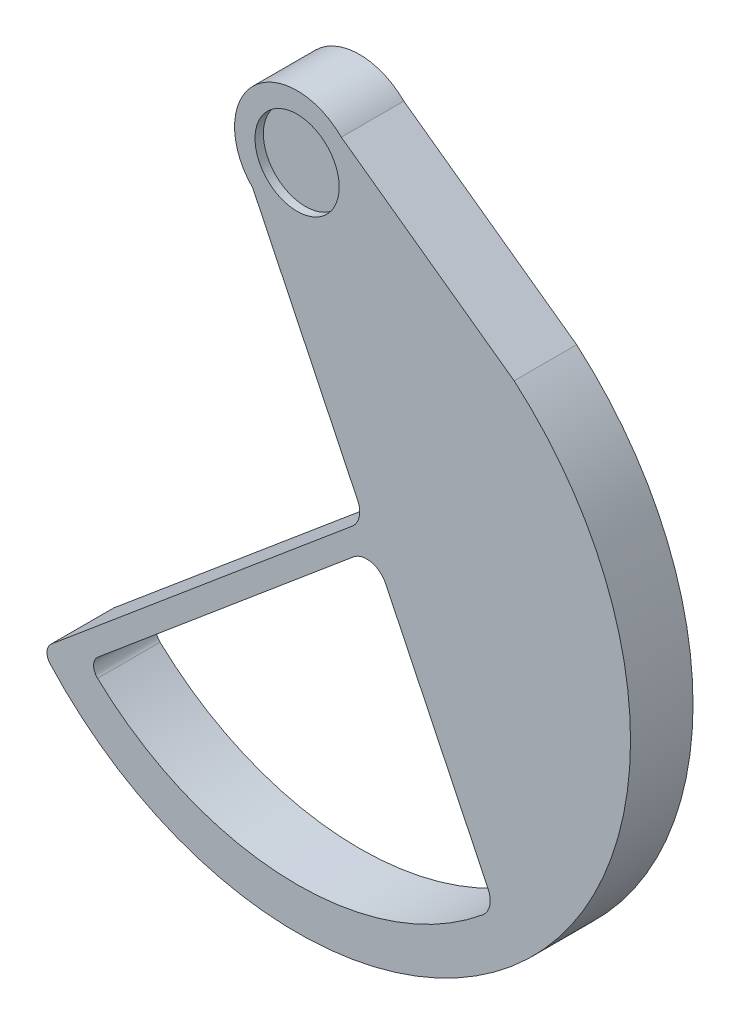
ISO-10303-21;
HEADER;
FILE_DESCRIPTION(('STEP AP214'),'2;1');
FILE_NAME('part.step','',(''),(''),'','','');
FILE_SCHEMA(('AUTOMOTIVE_DESIGN { 1 0 10303 214 1 1 1 1 }'));
ENDSEC;
DATA;
#1=APPLICATION_CONTEXT('core data for automotive mechanical design processes');
#2=APPLICATION_PROTOCOL_DEFINITION('international standard','automotive_design',2000,#1);
#3=PRODUCT_CONTEXT('',#1,'mechanical');
#4=PRODUCT('Part','Part','',(#3));
#5=PRODUCT_RELATED_PRODUCT_CATEGORY('part','',(#4));
#6=PRODUCT_DEFINITION_FORMATION('','',#4);
#7=PRODUCT_DEFINITION_CONTEXT('part definition',#1,'design');
#8=PRODUCT_DEFINITION('design','',#6,#7);
#9=PRODUCT_DEFINITION_SHAPE('','',#8);
#10=(LENGTH_UNIT() NAMED_UNIT(*) SI_UNIT(.MILLI.,.METRE.));
#11=(NAMED_UNIT(*) PLANE_ANGLE_UNIT() SI_UNIT($,.RADIAN.));
#12=(NAMED_UNIT(*) SI_UNIT($,.STERADIAN.) SOLID_ANGLE_UNIT());
#13=UNCERTAINTY_MEASURE_WITH_UNIT(LENGTH_MEASURE(1.E-05),#10,'distance_accuracy_value','');
#14=(GEOMETRIC_REPRESENTATION_CONTEXT(3) GLOBAL_UNCERTAINTY_ASSIGNED_CONTEXT((#13)) GLOBAL_UNIT_ASSIGNED_CONTEXT((#10,
#11,#12)) REPRESENTATION_CONTEXT('',''));
#15=CARTESIAN_POINT('',(0.,0.,0.));
#16=DIRECTION('',(0.,0.,1.));
#17=DIRECTION('',(1.,0.,0.));
#18=AXIS2_PLACEMENT_3D('',#15,#16,#17);
#19=CARTESIAN_POINT('',(-12.7570586950624,-6.1348621133076,15.));
#20=DIRECTION('',(0.901206602628173,0.433389731511241,0.));
#21=DIRECTION('',(-0.433389731511241,0.901206602628173,0.));
#22=AXIS2_PLACEMENT_3D('',#19,#20,#21);
#23=PLANE('',#22);
#24=DIRECTION('',(0.433389731511241,-0.901206602628173,0.));
#25=VECTOR('',#24,1.);
#26=CARTESIAN_POINT('',(-12.7570586950624,-6.1348621133076,0.));
#27=LINE('',#26,#25);
#28=CARTESIAN_POINT('',(21.2324006956412,-76.8137984043253,0.));
#29=VERTEX_POINT('',#28);
#30=CARTESIAN_POINT('',(45.844843506453,-127.9938203457,0.));
#31=VERTEX_POINT('',#30);
#32=EDGE_CURVE('E185',#29,#31,#27,.T.);
#33=ORIENTED_EDGE('',*,*,#32,.T.);
#34=DIRECTION('',(0.,0.,-1.));
#35=VECTOR('',#34,1.);
#36=CARTESIAN_POINT('',(45.844843506453,-127.9938203457,15.));
#37=LINE('',#36,#35);
#38=CARTESIAN_POINT('',(45.844843506453,-127.9938203457,15.));
#39=VERTEX_POINT('',#38);
#40=EDGE_CURVE('E11',#39,#31,#37,.T.);
#41=ORIENTED_EDGE('',*,*,#40,.F.);
#42=DIRECTION('',(0.433389731511241,-0.901206602628173,0.));
#43=VECTOR('',#42,1.);
#44=CARTESIAN_POINT('',(-12.7570586950624,-6.1348621133076,15.));
#45=LINE('',#44,#43);
#46=CARTESIAN_POINT('',(21.2324006956412,-76.8137984043253,15.));
#47=VERTEX_POINT('',#46);
#48=EDGE_CURVE('E250',#47,#39,#45,.T.);
#49=ORIENTED_EDGE('',*,*,#48,.F.);
#50=DIRECTION('',(0.,0.,-1.));
#51=VECTOR('',#50,1.);
#52=CARTESIAN_POINT('',(21.2324006956412,-76.8137984043253,15.));
#53=LINE('',#52,#51);
#54=EDGE_CURVE('E198',#47,#29,#53,.T.);
#55=ORIENTED_EDGE('',*,*,#54,.T.);
#56=EDGE_LOOP('',(#33,#41,#49,#55));
#57=FACE_BOUND('',#56,.T.);
#58=ADVANCED_FACE('F35',(#57),#23,.F.);
#59=CARTESIAN_POINT('',(41.3388104933121,-130.160769003256,15.));
#60=DIRECTION('',(0.,0.,-1.));
#61=DIRECTION('',(-1.,0.,0.));
#62=AXIS2_PLACEMENT_3D('',#59,#60,#61);
#63=CYLINDRICAL_SURFACE('',#62,4.99999999999999);
#64=CARTESIAN_POINT('',(41.3388104933121,-130.160769003256,0.));
#65=DIRECTION('',(0.,0.,1.));
#66=DIRECTION('',(1.,0.,0.));
#67=AXIS2_PLACEMENT_3D('',#64,#65,#66);
#68=CIRCLE('',#67,4.99999999999999);
#69=CARTESIAN_POINT('',(44.5187189927976,-134.019289695814,0.));
#70=VERTEX_POINT('',#69);
#71=EDGE_CURVE('E188',#31,#70,#68,.F.);
#72=ORIENTED_EDGE('',*,*,#71,.T.);
#73=DIRECTION('',(0.,0.,-1.));
#74=VECTOR('',#73,1.);
#75=CARTESIAN_POINT('',(44.5187189927976,-134.019289695814,15.));
#76=LINE('',#75,#74);
#77=CARTESIAN_POINT('',(44.5187189927976,-134.019289695814,15.));
#78=VERTEX_POINT('',#77);
#79=EDGE_CURVE('E45',#78,#70,#76,.T.);
#80=ORIENTED_EDGE('',*,*,#79,.F.);
#81=CARTESIAN_POINT('',(41.3388104933121,-130.160769003256,15.));
#82=DIRECTION('',(0.,0.,1.));
#83=DIRECTION('',(1.,0.,0.));
#84=AXIS2_PLACEMENT_3D('',#81,#82,#83);
#85=CIRCLE('',#84,4.99999999999999);
#86=EDGE_CURVE('E252',#39,#78,#85,.F.);
#87=ORIENTED_EDGE('',*,*,#86,.F.);
#88=ORIENTED_EDGE('',*,*,#40,.T.);
#89=EDGE_LOOP('',(#72,#80,#87,#88));
#90=FACE_BOUND('',#89,.T.);
#91=ADVANCED_FACE('F277',(#90),#63,.F.);
#92=CARTESIAN_POINT('',(0.,-80.,15.));
#93=DIRECTION('',(0.,0.,-1.));
#94=DIRECTION('',(-1.,0.,0.));
#95=AXIS2_PLACEMENT_3D('',#92,#93,#94);
#96=CYLINDRICAL_SURFACE('',#95,70.);
#97=CARTESIAN_POINT('',(0.,-80.,0.));
#98=DIRECTION('',(0.,0.,1.));
#99=DIRECTION('',(1.,0.,0.));
#100=AXIS2_PLACEMENT_3D('',#97,#98,#99);
#101=CIRCLE('',#100,70.);
#102=CARTESIAN_POINT('',(-47.870174388264,-131.072951785042,0.));
#103=VERTEX_POINT('',#102);
#104=EDGE_CURVE('E191',#103,#70,#101,.T.);
#105=ORIENTED_EDGE('',*,*,#104,.F.);
#106=DIRECTION('',(0.,0.,-1.));
#107=VECTOR('',#106,1.);
#108=CARTESIAN_POINT('',(-47.870174388264,-131.072951785042,15.));
#109=LINE('',#108,#107);
#110=CARTESIAN_POINT('',(-47.870174388264,-131.072951785042,15.));
#111=VERTEX_POINT('',#110);
#112=EDGE_CURVE('E155',#111,#103,#109,.T.);
#113=ORIENTED_EDGE('',*,*,#112,.F.);
#114=CARTESIAN_POINT('',(0.,-80.,15.));
#115=DIRECTION('',(0.,0.,1.));
#116=DIRECTION('',(1.,0.,0.));
#117=AXIS2_PLACEMENT_3D('',#114,#115,#116);
#118=CIRCLE('',#117,70.);
#119=EDGE_CURVE('E148',#111,#78,#118,.T.);
#120=ORIENTED_EDGE('',*,*,#119,.T.);
#121=ORIENTED_EDGE('',*,*,#79,.T.);
#122=EDGE_LOOP('',(#105,#113,#120,#121));
#123=FACE_BOUND('',#122,.T.);
#124=ADVANCED_FACE('F255',(#123),#96,.F.);
#125=CARTESIAN_POINT('',(-45.8185954859101,-128.884110994254,15.));
#126=DIRECTION('',(0.,0.,-1.));
#127=DIRECTION('',(-1.,0.,0.));
#128=AXIS2_PLACEMENT_3D('',#125,#126,#127);
#129=CYLINDRICAL_SURFACE('',#128,2.99999999999979);
#130=CARTESIAN_POINT('',(-45.8185954859101,-128.884110994254,0.));
#131=DIRECTION('',(0.,0.,1.));
#132=DIRECTION('',(1.,0.,0.));
#133=AXIS2_PLACEMENT_3D('',#130,#131,#132);
#134=CIRCLE('',#133,2.99999999999979);
#135=CARTESIAN_POINT('',(-47.7476784165524,-126.586582094174,0.));
#136=VERTEX_POINT('',#135);
#137=EDGE_CURVE('E154',#103,#136,#134,.F.);
#138=ORIENTED_EDGE('',*,*,#137,.T.);
#139=DIRECTION('',(0.,0.,-1.));
#140=VECTOR('',#139,1.);
#141=CARTESIAN_POINT('',(-47.7476784165524,-126.586582094174,15.));
#142=LINE('',#141,#140);
#143=CARTESIAN_POINT('',(-47.7476784165524,-126.586582094174,15.));
#144=VERTEX_POINT('',#143);
#145=EDGE_CURVE('E151',#144,#136,#142,.T.);
#146=ORIENTED_EDGE('',*,*,#145,.F.);
#147=CARTESIAN_POINT('',(-45.8185954859101,-128.884110994254,15.));
#148=DIRECTION('',(0.,0.,1.));
#149=DIRECTION('',(1.,0.,0.));
#150=AXIS2_PLACEMENT_3D('',#147,#148,#149);
#151=CIRCLE('',#150,2.99999999999979);
#152=EDGE_CURVE('E142',#111,#144,#151,.F.);
#153=ORIENTED_EDGE('',*,*,#152,.F.);
#154=ORIENTED_EDGE('',*,*,#112,.T.);
#155=EDGE_LOOP('',(#138,#146,#153,#154));
#156=FACE_BOUND('',#155,.T.);
#157=ADVANCED_FACE('F152',(#156),#129,.F.);
#158=CARTESIAN_POINT('',(42.5956727933285,-50.7312504333006,15.));
#159=DIRECTION('',(-0.643027643547508,0.765842966693394,0.));
#160=DIRECTION('',(-0.765842966693394,-0.643027643547508,0.));
#161=AXIS2_PLACEMENT_3D('',#158,#159,#160);
#162=PLANE('',#161);
#163=DIRECTION('',(0.765842966693394,0.643027643547508,0.));
#164=VECTOR('',#163,1.);
#165=CARTESIAN_POINT('',(42.5956727933285,-50.7312504333006,0.));
#166=LINE('',#165,#164);
#167=CARTESIAN_POINT('',(13.5112294647628,-75.1515322284145,0.));
#168=VERTEX_POINT('',#167);
#169=EDGE_CURVE('E98',#136,#168,#166,.T.);
#170=ORIENTED_EDGE('',*,*,#169,.T.);
#171=DIRECTION('',(0.,0.,-1.));
#172=VECTOR('',#171,1.);
#173=CARTESIAN_POINT('',(13.5112294647628,-75.1515322284145,15.));
#174=LINE('',#173,#172);
#175=CARTESIAN_POINT('',(13.5112294647628,-75.1515322284145,15.));
#176=VERTEX_POINT('',#175);
#177=EDGE_CURVE('E156',#176,#168,#174,.T.);
#178=ORIENTED_EDGE('',*,*,#177,.F.);
#179=DIRECTION('',(0.765842966693394,0.643027643547508,0.));
#180=VECTOR('',#179,1.);
#181=CARTESIAN_POINT('',(42.5956727933285,-50.7312504333006,15.));
#182=LINE('',#181,#180);
#183=EDGE_CURVE('E146',#144,#176,#182,.T.);
#184=ORIENTED_EDGE('',*,*,#183,.F.);
#185=ORIENTED_EDGE('',*,*,#145,.T.);
#186=EDGE_LOOP('',(#170,#178,#184,#185));
#187=FACE_BOUND('',#186,.T.);
#188=ADVANCED_FACE('F158',(#187),#162,.F.);
#189=CARTESIAN_POINT('',(10.0302471408598,-65.0565868768263,15.));
#190=DIRECTION('',(0.,0.,-1.));
#191=DIRECTION('',(-1.,0.,0.));
#192=AXIS2_PLACEMENT_3D('',#189,#190,#191);
#193=CYLINDRICAL_SURFACE('',#192,5.);
#194=CARTESIAN_POINT('',(10.0302471408598,-65.0565868768263,0.));
#195=DIRECTION('',(0.,0.,1.));
#196=DIRECTION('',(1.,0.,0.));
#197=AXIS2_PLACEMENT_3D('',#194,#195,#196);
#198=CIRCLE('',#197,5.);
#199=CARTESIAN_POINT('',(13.2441851892925,-68.8868090924212,0.));
#200=VERTEX_POINT('',#199);
#201=CARTESIAN_POINT('',(14.5362801540007,-62.8896382192701,0.));
#202=VERTEX_POINT('',#201);
#203=EDGE_CURVE('E164',#200,#202,#198,.T.);
#204=ORIENTED_EDGE('',*,*,#203,.F.);
#205=DIRECTION('',(0.,0.,-1.));
#206=VECTOR('',#205,1.);
#207=CARTESIAN_POINT('',(13.2441851892925,-68.8868090924212,15.));
#208=LINE('',#207,#206);
#209=CARTESIAN_POINT('',(13.2441851892925,-68.8868090924212,15.));
#210=VERTEX_POINT('',#209);
#211=EDGE_CURVE('E39',#210,#200,#208,.T.);
#212=ORIENTED_EDGE('',*,*,#211,.F.);
#213=CARTESIAN_POINT('',(10.0302471408598,-65.0565868768263,15.));
#214=DIRECTION('',(0.,0.,1.));
#215=DIRECTION('',(1.,0.,0.));
#216=AXIS2_PLACEMENT_3D('',#213,#214,#215);
#217=CIRCLE('',#216,5.);
#218=CARTESIAN_POINT('',(14.5362801540007,-62.8896382192701,15.));
#219=VERTEX_POINT('',#218);
#220=EDGE_CURVE('E197',#210,#219,#217,.T.);
#221=ORIENTED_EDGE('',*,*,#220,.T.);
#222=DIRECTION('',(0.,0.,-1.));
#223=VECTOR('',#222,1.);
#224=CARTESIAN_POINT('',(14.5362801540007,-62.8896382192701,15.));
#225=LINE('',#224,#223);
#226=EDGE_CURVE('E160',#219,#202,#225,.T.);
#227=ORIENTED_EDGE('',*,*,#226,.T.);
#228=EDGE_LOOP('',(#204,#212,#221,#227));
#229=FACE_BOUND('',#228,.T.);
#230=ADVANCED_FACE('F37',(#229),#193,.F.);
#231=CARTESIAN_POINT('',(39.3923101204882,-46.9459271066778,15.));
#232=DIRECTION('',(-0.642787609686534,0.766044443118983,0.));
#233=DIRECTION('',(-0.766044443118982,-0.642787609686534,0.));
#234=AXIS2_PLACEMENT_3D('',#231,#232,#233);
#235=PLANE('',#234);
#236=DIRECTION('',(0.766044443118982,0.642787609686534,0.));
#237=VECTOR('',#236,1.);
#238=CARTESIAN_POINT('',(39.3923101204882,-46.9459271066778,0.));
#239=LINE('',#238,#237);
#240=CARTESIAN_POINT('',(-58.9406362868111,-129.457066169617,0.));
#241=VERTEX_POINT('',#240);
#242=EDGE_CURVE('E167',#241,#200,#239,.T.);
#243=ORIENTED_EDGE('',*,*,#242,.F.);
#244=DIRECTION('',(0.,0.,-1.));
#245=VECTOR('',#244,1.);
#246=CARTESIAN_POINT('',(-58.9406362868111,-129.457066169617,15.));
#247=LINE('',#246,#245);
#248=CARTESIAN_POINT('',(-58.9406362868111,-129.457066169617,15.));
#249=VERTEX_POINT('',#248);
#250=EDGE_CURVE('E212',#249,#241,#247,.T.);
#251=ORIENTED_EDGE('',*,*,#250,.F.);
#252=DIRECTION('',(0.766044443118982,0.642787609686534,0.));
#253=VECTOR('',#252,1.);
#254=CARTESIAN_POINT('',(39.3923101204882,-46.9459271066778,15.));
#255=LINE('',#254,#253);
#256=EDGE_CURVE('E221',#249,#210,#255,.T.);
#257=ORIENTED_EDGE('',*,*,#256,.T.);
#258=ORIENTED_EDGE('',*,*,#211,.T.);
#259=EDGE_LOOP('',(#243,#251,#257,#258));
#260=FACE_BOUND('',#259,.T.);
#261=ADVANCED_FACE('F219',(#260),#235,.T.);
#262=CARTESIAN_POINT('',(-57.0122734577518,-131.755199498973,15.));
#263=DIRECTION('',(0.,0.,-1.));
#264=DIRECTION('',(-1.,0.,0.));
#265=AXIS2_PLACEMENT_3D('',#262,#263,#264);
#266=CYLINDRICAL_SURFACE('',#265,2.99999999999976);
#267=CARTESIAN_POINT('',(-57.0122734577518,-131.755199498973,0.));
#268=DIRECTION('',(0.,0.,1.));
#269=DIRECTION('',(1.,0.,0.));
#270=AXIS2_PLACEMENT_3D('',#267,#268,#269);
#271=CIRCLE('',#270,2.99999999999976);
#272=CARTESIAN_POINT('',(-59.2335308651964,-133.771635843089,0.));
#273=VERTEX_POINT('',#272);
#274=EDGE_CURVE('E171',#273,#241,#271,.F.);
#275=ORIENTED_EDGE('',*,*,#274,.F.);
#276=DIRECTION('',(0.,0.,-1.));
#277=VECTOR('',#276,1.);
#278=CARTESIAN_POINT('',(-59.2335308651964,-133.771635843089,15.));
#279=LINE('',#278,#277);
#280=CARTESIAN_POINT('',(-59.2335308651964,-133.771635843089,15.));
#281=VERTEX_POINT('',#280);
#282=EDGE_CURVE('E211',#281,#273,#279,.T.);
#283=ORIENTED_EDGE('',*,*,#282,.F.);
#284=CARTESIAN_POINT('',(-57.0122734577518,-131.755199498973,15.));
#285=DIRECTION('',(0.,0.,1.));
#286=DIRECTION('',(1.,0.,0.));
#287=AXIS2_PLACEMENT_3D('',#284,#285,#286);
#288=CIRCLE('',#287,2.99999999999976);
#289=EDGE_CURVE('E231',#281,#249,#288,.F.);
#290=ORIENTED_EDGE('',*,*,#289,.T.);
#291=ORIENTED_EDGE('',*,*,#250,.T.);
#292=EDGE_LOOP('',(#275,#283,#290,#291));
#293=FACE_BOUND('',#292,.T.);
#294=ADVANCED_FACE('F228',(#293),#266,.T.);
#295=CARTESIAN_POINT('',(0.,-80.,15.));
#296=DIRECTION('',(0.,0.,-1.));
#297=DIRECTION('',(-1.,0.,0.));
#298=AXIS2_PLACEMENT_3D('',#295,#296,#297);
#299=CYLINDRICAL_SURFACE('',#298,80.);
#300=CARTESIAN_POINT('',(0.,-80.,0.));
#301=DIRECTION('',(0.,0.,1.));
#302=DIRECTION('',(1.,0.,0.));
#303=AXIS2_PLACEMENT_3D('',#300,#301,#302);
#304=CIRCLE('',#303,80.);
#305=CARTESIAN_POINT('',(52.0761789176771,-19.2705047828151,0.));
#306=VERTEX_POINT('',#305);
#307=EDGE_CURVE('E174',#273,#306,#304,.T.);
#308=ORIENTED_EDGE('',*,*,#307,.T.);
#309=DIRECTION('',(0.,0.,-1.));
#310=VECTOR('',#309,1.);
#311=CARTESIAN_POINT('',(52.0761789176771,-19.2705047828151,15.));
#312=LINE('',#311,#310);
#313=CARTESIAN_POINT('',(52.0761789176771,-19.2705047828151,15.));
#314=VERTEX_POINT('',#313);
#315=EDGE_CURVE('E209',#314,#306,#312,.T.);
#316=ORIENTED_EDGE('',*,*,#315,.F.);
#317=CARTESIAN_POINT('',(0.,-80.,15.));
#318=DIRECTION('',(0.,0.,1.));
#319=DIRECTION('',(1.,0.,0.));
#320=AXIS2_PLACEMENT_3D('',#317,#318,#319);
#321=CIRCLE('',#320,80.);
#322=EDGE_CURVE('E234',#281,#314,#321,.T.);
#323=ORIENTED_EDGE('',*,*,#322,.F.);
#324=ORIENTED_EDGE('',*,*,#282,.T.);
#325=EDGE_LOOP('',(#308,#316,#323,#324));
#326=FACE_BOUND('',#325,.T.);
#327=ADVANCED_FACE('F235',(#326),#299,.T.);
#328=CARTESIAN_POINT('',(8.65474635415258,12.0128323695447,15.));
#329=DIRECTION('',(0.584549661802916,0.811357931424902,0.));
#330=DIRECTION('',(-0.811357931424902,0.584549661802916,0.));
#331=AXIS2_PLACEMENT_3D('',#328,#329,#330);
#332=PLANE('',#331);
#333=DIRECTION('',(0.811357931424902,-0.584549661802916,0.));
#334=VECTOR('',#333,1.);
#335=CARTESIAN_POINT('',(8.65474635415258,12.0128323695447,0.));
#336=LINE('',#335,#334);
#337=CARTESIAN_POINT('',(10.6066017177981,10.6066017177983,0.));
#338=VERTEX_POINT('',#337);
#339=EDGE_CURVE('E177',#338,#306,#336,.T.);
#340=ORIENTED_EDGE('',*,*,#339,.F.);
#341=DIRECTION('',(0.,0.,-1.));
#342=VECTOR('',#341,1.);
#343=CARTESIAN_POINT('',(10.6066017177981,10.6066017177983,15.));
#344=LINE('',#343,#342);
#345=CARTESIAN_POINT('',(10.6066017177981,10.6066017177983,15.));
#346=VERTEX_POINT('',#345);
#347=EDGE_CURVE('E207',#346,#338,#344,.T.);
#348=ORIENTED_EDGE('',*,*,#347,.F.);
#349=DIRECTION('',(0.811357931424902,-0.584549661802916,0.));
#350=VECTOR('',#349,1.);
#351=CARTESIAN_POINT('',(8.65474635415258,12.0128323695447,15.));
#352=LINE('',#351,#350);
#353=EDGE_CURVE('E239',#346,#314,#352,.T.);
#354=ORIENTED_EDGE('',*,*,#353,.T.);
#355=ORIENTED_EDGE('',*,*,#315,.T.);
#356=EDGE_LOOP('',(#340,#348,#354,#355));
#357=FACE_BOUND('',#356,.T.);
#358=ADVANCED_FACE('F288',(#357),#332,.T.);
#359=CARTESIAN_POINT('',(0.,0.,15.));
#360=DIRECTION('',(0.,0.,-1.));
#361=DIRECTION('',(-1.,0.,0.));
#362=AXIS2_PLACEMENT_3D('',#359,#360,#361);
#363=CYLINDRICAL_SURFACE('',#362,15.);
#364=CARTESIAN_POINT('',(0.,0.,0.));
#365=DIRECTION('',(0.,0.,1.));
#366=DIRECTION('',(1.,0.,0.));
#367=AXIS2_PLACEMENT_3D('',#364,#365,#366);
#368=CIRCLE('',#367,15.);
#369=CARTESIAN_POINT('',(-10.6066017177981,-10.6066017177983,0.));
#370=VERTEX_POINT('',#369);
#371=EDGE_CURVE('E180',#338,#370,#368,.T.);
#372=ORIENTED_EDGE('',*,*,#371,.T.);
#373=DIRECTION('',(0.,0.,-1.));
#374=VECTOR('',#373,1.);
#375=CARTESIAN_POINT('',(-10.6066017177981,-10.6066017177983,15.));
#376=LINE('',#375,#374);
#377=CARTESIAN_POINT('',(-10.6066017177981,-10.6066017177983,15.));
#378=VERTEX_POINT('',#377);
#379=EDGE_CURVE('E204',#378,#370,#376,.T.);
#380=ORIENTED_EDGE('',*,*,#379,.F.);
#381=CARTESIAN_POINT('',(0.,0.,15.));
#382=DIRECTION('',(0.,0.,1.));
#383=DIRECTION('',(1.,0.,0.));
#384=AXIS2_PLACEMENT_3D('',#381,#382,#383);
#385=CIRCLE('',#384,15.);
#386=EDGE_CURVE('E246',#346,#378,#385,.T.);
#387=ORIENTED_EDGE('',*,*,#386,.F.);
#388=ORIENTED_EDGE('',*,*,#347,.T.);
#389=EDGE_LOOP('',(#372,#380,#387,#388));
#390=FACE_BOUND('',#389,.T.);
#391=ADVANCED_FACE('F271',(#390),#363,.T.);
#392=CARTESIAN_POINT('',(-12.7570586950624,-6.13486211330761,15.));
#393=DIRECTION('',(0.901206602628173,0.433389731511242,0.));
#394=DIRECTION('',(-0.433389731511242,0.901206602628173,0.));
#395=AXIS2_PLACEMENT_3D('',#392,#393,#394);
#396=PLANE('',#395);
#397=DIRECTION('',(0.433389731511242,-0.901206602628173,0.));
#398=VECTOR('',#397,1.);
#399=CARTESIAN_POINT('',(-12.7570586950624,-6.13486211330761,0.));
#400=LINE('',#399,#398);
#401=EDGE_CURVE('E182',#370,#202,#400,.T.);
#402=ORIENTED_EDGE('',*,*,#401,.T.);
#403=ORIENTED_EDGE('',*,*,#226,.F.);
#404=DIRECTION('',(0.433389731511242,-0.901206602628173,0.));
#405=VECTOR('',#404,1.);
#406=CARTESIAN_POINT('',(-12.7570586950624,-6.13486211330761,15.));
#407=LINE('',#406,#405);
#408=EDGE_CURVE('E248',#378,#219,#407,.T.);
#409=ORIENTED_EDGE('',*,*,#408,.F.);
#410=ORIENTED_EDGE('',*,*,#379,.T.);
#411=EDGE_LOOP('',(#402,#403,#409,#410));
#412=FACE_BOUND('',#411,.T.);
#413=ADVANCED_FACE('F263',(#412),#396,.F.);
#414=CARTESIAN_POINT('',(16.7263676825004,-78.9807470618814,15.));
#415=DIRECTION('',(0.,0.,-1.));
#416=DIRECTION('',(-1.,0.,0.));
#417=AXIS2_PLACEMENT_3D('',#414,#415,#416);
#418=CYLINDRICAL_SURFACE('',#417,5.);
#419=CARTESIAN_POINT('',(16.7263676825004,-78.9807470618814,0.));
#420=DIRECTION('',(0.,0.,1.));
#421=DIRECTION('',(1.,0.,0.));
#422=AXIS2_PLACEMENT_3D('',#419,#420,#421);
#423=CIRCLE('',#422,5.);
#424=EDGE_CURVE('E104',#168,#29,#423,.F.);
#425=ORIENTED_EDGE('',*,*,#424,.T.);
#426=ORIENTED_EDGE('',*,*,#54,.F.);
#427=CARTESIAN_POINT('',(16.7263676825004,-78.9807470618814,15.));
#428=DIRECTION('',(0.,0.,1.));
#429=DIRECTION('',(1.,0.,0.));
#430=AXIS2_PLACEMENT_3D('',#427,#428,#429);
#431=CIRCLE('',#430,5.);
#432=EDGE_CURVE('E54',#176,#47,#431,.F.);
#433=ORIENTED_EDGE('',*,*,#432,.F.);
#434=ORIENTED_EDGE('',*,*,#177,.T.);
#435=EDGE_LOOP('',(#425,#426,#433,#434));
#436=FACE_BOUND('',#435,.T.);
#437=ADVANCED_FACE('F261',(#436),#418,.F.);
#438=CARTESIAN_POINT('',(0.,0.,15.));
#439=DIRECTION('',(0.,0.,1.));
#440=DIRECTION('',(1.,0.,0.));
#441=AXIS2_PLACEMENT_3D('',#438,#439,#440);
#442=PLANE('',#441);
#443=CARTESIAN_POINT('',(0.,0.,15.));
#444=DIRECTION('',(0.,0.,1.));
#445=DIRECTION('',(1.,0.,0.));
#446=AXIS2_PLACEMENT_3D('',#443,#444,#445);
#447=CIRCLE('',#446,10.1);
#448=CARTESIAN_POINT('',(10.1,0.,15.));
#449=VERTEX_POINT('',#448);
#450=EDGE_CURVE('E402',#449,#449,#447,.T.);
#451=ORIENTED_EDGE('',*,*,#450,.F.);
#452=EDGE_LOOP('',(#451));
#453=FACE_BOUND('',#452,.T.);
#454=ORIENTED_EDGE('',*,*,#220,.F.);
#455=ORIENTED_EDGE('',*,*,#256,.F.);
#456=ORIENTED_EDGE('',*,*,#289,.F.);
#457=ORIENTED_EDGE('',*,*,#322,.T.);
#458=ORIENTED_EDGE('',*,*,#353,.F.);
#459=ORIENTED_EDGE('',*,*,#386,.T.);
#460=ORIENTED_EDGE('',*,*,#408,.T.);
#461=EDGE_LOOP('',(#454,#455,#456,#457,#458,#459,#460));
#462=FACE_BOUND('',#461,.T.);
#463=ORIENTED_EDGE('',*,*,#48,.T.);
#464=ORIENTED_EDGE('',*,*,#86,.T.);
#465=ORIENTED_EDGE('',*,*,#119,.F.);
#466=ORIENTED_EDGE('',*,*,#152,.T.);
#467=ORIENTED_EDGE('',*,*,#183,.T.);
#468=ORIENTED_EDGE('',*,*,#432,.T.);
#469=EDGE_LOOP('',(#463,#464,#465,#466,#467,#468));
#470=FACE_BOUND('',#469,.T.);
#471=ADVANCED_FACE('F144',(#453,#462,#470),#442,.T.);
#472=CARTESIAN_POINT('',(0.,0.,0.));
#473=DIRECTION('',(0.,0.,1.));
#474=DIRECTION('',(1.,0.,0.));
#475=AXIS2_PLACEMENT_3D('',#472,#473,#474);
#476=PLANE('',#475);
#477=ORIENTED_EDGE('',*,*,#203,.T.);
#478=ORIENTED_EDGE('',*,*,#401,.F.);
#479=ORIENTED_EDGE('',*,*,#371,.F.);
#480=ORIENTED_EDGE('',*,*,#339,.T.);
#481=ORIENTED_EDGE('',*,*,#307,.F.);
#482=ORIENTED_EDGE('',*,*,#274,.T.);
#483=ORIENTED_EDGE('',*,*,#242,.T.);
#484=EDGE_LOOP('',(#477,#478,#479,#480,#481,#482,#483));
#485=FACE_BOUND('',#484,.T.);
#486=ORIENTED_EDGE('',*,*,#32,.F.);
#487=ORIENTED_EDGE('',*,*,#424,.F.);
#488=ORIENTED_EDGE('',*,*,#169,.F.);
#489=ORIENTED_EDGE('',*,*,#137,.F.);
#490=ORIENTED_EDGE('',*,*,#104,.T.);
#491=ORIENTED_EDGE('',*,*,#71,.F.);
#492=EDGE_LOOP('',(#486,#487,#488,#489,#490,#491));
#493=FACE_BOUND('',#492,.T.);
#494=ADVANCED_FACE('F225',(#485,#493),#476,.F.);
#495=CARTESIAN_POINT('',(0.,0.,13.));
#496=DIRECTION('',(0.,0.,1.));
#497=DIRECTION('',(1.,0.,0.));
#498=AXIS2_PLACEMENT_3D('',#495,#496,#497);
#499=CYLINDRICAL_SURFACE('',#498,10.1);
#500=CARTESIAN_POINT('',(0.,0.,13.));
#501=DIRECTION('',(0.,0.,1.));
#502=DIRECTION('',(1.,0.,0.));
#503=AXIS2_PLACEMENT_3D('',#500,#501,#502);
#504=CIRCLE('',#503,10.1);
#505=CARTESIAN_POINT('',(10.1,0.,13.));
#506=VERTEX_POINT('',#505);
#507=EDGE_CURVE('E168',#506,#506,#504,.T.);
#508=ORIENTED_EDGE('',*,*,#507,.F.);
#509=EDGE_LOOP('',(#508));
#510=FACE_BOUND('',#509,.T.);
#511=ORIENTED_EDGE('',*,*,#450,.T.);
#512=EDGE_LOOP('',(#511));
#513=FACE_BOUND('',#512,.T.);
#514=ADVANCED_FACE('F373',(#510,#513),#499,.F.);
#515=CARTESIAN_POINT('',(0.,0.,13.));
#516=DIRECTION('',(0.,0.,1.));
#517=DIRECTION('',(1.,0.,0.));
#518=AXIS2_PLACEMENT_3D('',#515,#516,#517);
#519=PLANE('',#518);
#520=ORIENTED_EDGE('',*,*,#507,.T.);
#521=EDGE_LOOP('',(#520));
#522=FACE_BOUND('',#521,.T.);
#523=ADVANCED_FACE('F386',(#522),#519,.T.);
#524=CLOSED_SHELL('',(#58,#91,#124,#157,#188,#230,#261,#294,#327,#358,#391,#413,#437,#471,#494,
#514,#523));
#525=MANIFOLD_SOLID_BREP('B2',#524);
#526=ADVANCED_BREP_SHAPE_REPRESENTATION('',(#18,#525),#14);
#527=SHAPE_DEFINITION_REPRESENTATION(#9,#526);
ENDSEC;
END-ISO-10303-21;
